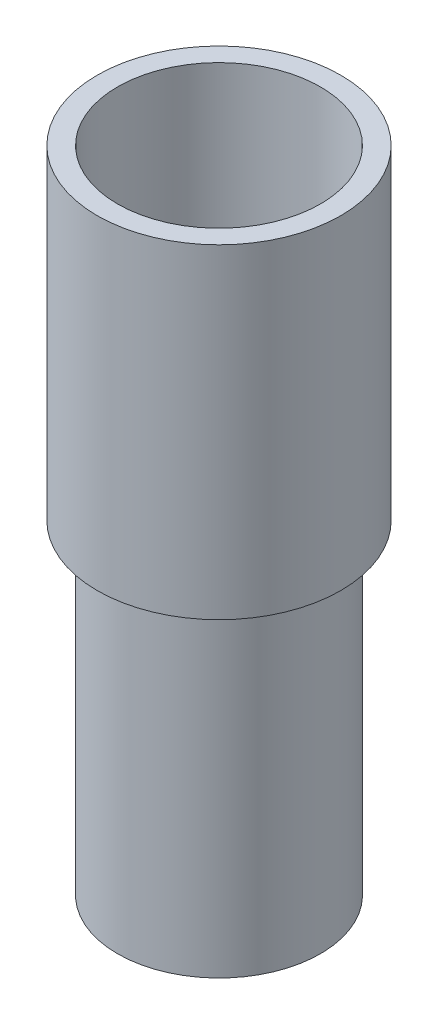
ISO-10303-21;
HEADER;
FILE_DESCRIPTION(('STEP AP214'),'2;1');
FILE_NAME('part.step','',(''),(''),'','','');
FILE_SCHEMA(('AUTOMOTIVE_DESIGN { 1 0 10303 214 1 1 1 1 }'));
ENDSEC;
DATA;
#1=APPLICATION_CONTEXT('core data for automotive mechanical design processes');
#2=APPLICATION_PROTOCOL_DEFINITION('international standard','automotive_design',2000,#1);
#3=PRODUCT_CONTEXT('',#1,'mechanical');
#4=PRODUCT('Part','Part','',(#3));
#5=PRODUCT_RELATED_PRODUCT_CATEGORY('part','',(#4));
#6=PRODUCT_DEFINITION_FORMATION('','',#4);
#7=PRODUCT_DEFINITION_CONTEXT('part definition',#1,'design');
#8=PRODUCT_DEFINITION('design','',#6,#7);
#9=PRODUCT_DEFINITION_SHAPE('','',#8);
#10=(LENGTH_UNIT() NAMED_UNIT(*) SI_UNIT(.MILLI.,.METRE.));
#11=(NAMED_UNIT(*) PLANE_ANGLE_UNIT() SI_UNIT($,.RADIAN.));
#12=(NAMED_UNIT(*) SI_UNIT($,.STERADIAN.) SOLID_ANGLE_UNIT());
#13=UNCERTAINTY_MEASURE_WITH_UNIT(LENGTH_MEASURE(1.E-05),#10,'distance_accuracy_value','');
#14=(GEOMETRIC_REPRESENTATION_CONTEXT(3) GLOBAL_UNCERTAINTY_ASSIGNED_CONTEXT((#13)) GLOBAL_UNIT_ASSIGNED_CONTEXT((#10,
#11,#12)) REPRESENTATION_CONTEXT('',''));
#15=CARTESIAN_POINT('',(0.,0.,0.));
#16=DIRECTION('',(0.,0.,1.));
#17=DIRECTION('',(1.,0.,0.));
#18=AXIS2_PLACEMENT_3D('',#15,#16,#17);
#19=CARTESIAN_POINT('',(0.,0.,0.));
#20=DIRECTION('',(0.,1.,0.));
#21=DIRECTION('',(0.,0.,1.));
#22=AXIS2_PLACEMENT_3D('',#19,#20,#21);
#23=PLANE('',#22);
#24=CARTESIAN_POINT('',(0.,0.,0.));
#25=DIRECTION('',(0.,1.,0.));
#26=DIRECTION('',(0.,0.,1.));
#27=AXIS2_PLACEMENT_3D('',#24,#25,#26);
#28=CIRCLE('',#27,7.9375);
#29=CARTESIAN_POINT('',(0.,0.,7.9375));
#30=VERTEX_POINT('',#29);
#31=EDGE_CURVE('E72',#30,#30,#28,.T.);
#32=ORIENTED_EDGE('',*,*,#31,.T.);
#33=EDGE_LOOP('',(#32));
#34=FACE_BOUND('',#33,.T.);
#35=CARTESIAN_POINT('',(0.,0.,0.));
#36=DIRECTION('',(0.,1.,0.));
#37=DIRECTION('',(0.,0.,1.));
#38=AXIS2_PLACEMENT_3D('',#35,#36,#37);
#39=CIRCLE('',#38,9.525);
#40=CARTESIAN_POINT('',(0.,0.,9.525));
#41=VERTEX_POINT('',#40);
#42=EDGE_CURVE('E63',#41,#41,#39,.T.);
#43=ORIENTED_EDGE('',*,*,#42,.F.);
#44=EDGE_LOOP('',(#43));
#45=FACE_BOUND('',#44,.T.);
#46=ADVANCED_FACE('F59',(#34,#45),#23,.F.);
#47=CARTESIAN_POINT('',(0.,25.4,0.));
#48=DIRECTION('',(0.,-1.,0.));
#49=DIRECTION('',(0.,0.,-1.));
#50=AXIS2_PLACEMENT_3D('',#47,#48,#49);
#51=CYLINDRICAL_SURFACE('',#50,9.525);
#52=CARTESIAN_POINT('',(0.,25.4,0.));
#53=DIRECTION('',(0.,1.,0.));
#54=DIRECTION('',(0.,0.,1.));
#55=AXIS2_PLACEMENT_3D('',#52,#53,#54);
#56=CIRCLE('',#55,9.525);
#57=CARTESIAN_POINT('',(0.,25.4,9.525));
#58=VERTEX_POINT('',#57);
#59=EDGE_CURVE('E11',#58,#58,#56,.T.);
#60=ORIENTED_EDGE('',*,*,#59,.F.);
#61=EDGE_LOOP('',(#60));
#62=FACE_BOUND('',#61,.T.);
#63=ORIENTED_EDGE('',*,*,#42,.T.);
#64=EDGE_LOOP('',(#63));
#65=FACE_BOUND('',#64,.T.);
#66=ADVANCED_FACE('F61',(#62,#65),#51,.T.);
#67=CARTESIAN_POINT('',(0.,25.4,0.));
#68=DIRECTION('',(0.,1.,0.));
#69=DIRECTION('',(0.,0.,1.));
#70=AXIS2_PLACEMENT_3D('',#67,#68,#69);
#71=PLANE('',#70);
#72=CARTESIAN_POINT('',(0.,25.4,0.));
#73=DIRECTION('',(0.,1.,0.));
#74=DIRECTION('',(0.,0.,1.));
#75=AXIS2_PLACEMENT_3D('',#72,#73,#74);
#76=CIRCLE('',#75,7.9375);
#77=CARTESIAN_POINT('',(0.,25.4,7.9375));
#78=VERTEX_POINT('',#77);
#79=EDGE_CURVE('E80',#78,#78,#76,.T.);
#80=ORIENTED_EDGE('',*,*,#79,.F.);
#81=EDGE_LOOP('',(#80));
#82=FACE_BOUND('',#81,.T.);
#83=ORIENTED_EDGE('',*,*,#59,.T.);
#84=EDGE_LOOP('',(#83));
#85=FACE_BOUND('',#84,.T.);
#86=ADVANCED_FACE('F103',(#82,#85),#71,.T.);
#87=CARTESIAN_POINT('',(0.,-25.4,0.));
#88=DIRECTION('',(0.,1.,0.));
#89=DIRECTION('',(0.,0.,1.));
#90=AXIS2_PLACEMENT_3D('',#87,#88,#89);
#91=CYLINDRICAL_SURFACE('',#90,7.9375);
#92=CARTESIAN_POINT('',(0.,-25.4,0.));
#93=DIRECTION('',(0.,1.,0.));
#94=DIRECTION('',(0.,0.,1.));
#95=AXIS2_PLACEMENT_3D('',#92,#93,#94);
#96=CIRCLE('',#95,7.9375);
#97=CARTESIAN_POINT('',(0.,-25.4,7.9375));
#98=VERTEX_POINT('',#97);
#99=EDGE_CURVE('E70',#98,#98,#96,.T.);
#100=ORIENTED_EDGE('',*,*,#99,.T.);
#101=EDGE_LOOP('',(#100));
#102=FACE_BOUND('',#101,.T.);
#103=ORIENTED_EDGE('',*,*,#31,.F.);
#104=EDGE_LOOP('',(#103));
#105=FACE_BOUND('',#104,.T.);
#106=ADVANCED_FACE('F97',(#102,#105),#91,.T.);
#107=CARTESIAN_POINT('',(0.,-25.4,0.));
#108=DIRECTION('',(0.,1.,0.));
#109=DIRECTION('',(0.,0.,1.));
#110=AXIS2_PLACEMENT_3D('',#107,#108,#109);
#111=PLANE('',#110);
#112=CARTESIAN_POINT('',(0.,-25.4,0.));
#113=DIRECTION('',(0.,-1.,0.));
#114=DIRECTION('',(0.,0.,-1.));
#115=AXIS2_PLACEMENT_3D('',#112,#113,#114);
#116=CIRCLE('',#115,6.34999999999999);
#117=CARTESIAN_POINT('',(0.,-25.4,-6.34999999999999));
#118=VERTEX_POINT('',#117);
#119=EDGE_CURVE('E86',#118,#118,#116,.T.);
#120=ORIENTED_EDGE('',*,*,#119,.F.);
#121=EDGE_LOOP('',(#120));
#122=FACE_BOUND('',#121,.T.);
#123=ORIENTED_EDGE('',*,*,#99,.F.);
#124=EDGE_LOOP('',(#123));
#125=FACE_BOUND('',#124,.T.);
#126=ADVANCED_FACE('F93',(#122,#125),#111,.F.);
#127=CARTESIAN_POINT('',(0.,4.76933116353126,0.));
#128=DIRECTION('',(0.,1.,0.));
#129=DIRECTION('',(0.,0.,1.));
#130=AXIS2_PLACEMENT_3D('',#127,#128,#129);
#131=CONICAL_SURFACE('',#130,7.9375,1.02974425867665);
#132=CARTESIAN_POINT('',(0.,3.81546493082501,0.));
#133=DIRECTION('',(0.,1.,0.));
#134=DIRECTION('',(0.,0.,1.));
#135=AXIS2_PLACEMENT_3D('',#132,#133,#134);
#136=CIRCLE('',#135,6.34999999999999);
#137=CARTESIAN_POINT('',(0.,3.81546493082501,6.34999999999999));
#138=VERTEX_POINT('',#137);
#139=EDGE_CURVE('E83',#138,#138,#136,.F.);
#140=ORIENTED_EDGE('',*,*,#139,.T.);
#141=EDGE_LOOP('',(#140));
#142=FACE_BOUND('',#141,.T.);
#143=CARTESIAN_POINT('',(0.,4.76933116353126,0.));
#144=DIRECTION('',(0.,1.,0.));
#145=DIRECTION('',(0.,0.,1.));
#146=AXIS2_PLACEMENT_3D('',#143,#144,#145);
#147=CIRCLE('',#146,7.9375);
#148=CARTESIAN_POINT('',(0.,4.76933116353126,7.9375));
#149=VERTEX_POINT('',#148);
#150=EDGE_CURVE('E75',#149,#149,#147,.T.);
#151=ORIENTED_EDGE('',*,*,#150,.T.);
#152=EDGE_LOOP('',(#151));
#153=FACE_BOUND('',#152,.T.);
#154=ADVANCED_FACE('F96',(#142,#153),#131,.F.);
#155=CARTESIAN_POINT('',(0.,25.4,0.));
#156=DIRECTION('',(0.,1.,0.));
#157=DIRECTION('',(0.,0.,1.));
#158=AXIS2_PLACEMENT_3D('',#155,#156,#157);
#159=CYLINDRICAL_SURFACE('',#158,7.9375);
#160=ORIENTED_EDGE('',*,*,#150,.F.);
#161=EDGE_LOOP('',(#160));
#162=FACE_BOUND('',#161,.T.);
#163=ORIENTED_EDGE('',*,*,#79,.T.);
#164=EDGE_LOOP('',(#163));
#165=FACE_BOUND('',#164,.T.);
#166=ADVANCED_FACE('F125',(#162,#165),#159,.F.);
#167=CARTESIAN_POINT('',(0.,-25.4,0.));
#168=DIRECTION('',(0.,-1.,0.));
#169=DIRECTION('',(0.,0.,-1.));
#170=AXIS2_PLACEMENT_3D('',#167,#168,#169);
#171=CYLINDRICAL_SURFACE('',#170,6.34999999999999);
#172=ORIENTED_EDGE('',*,*,#119,.T.);
#173=EDGE_LOOP('',(#172));
#174=FACE_BOUND('',#173,.T.);
#175=ORIENTED_EDGE('',*,*,#139,.F.);
#176=EDGE_LOOP('',(#175));
#177=FACE_BOUND('',#176,.T.);
#178=ADVANCED_FACE('F90',(#174,#177),#171,.F.);
#179=CLOSED_SHELL('',(#46,#66,#86,#106,#126,#154,#166,#178));
#180=MANIFOLD_SOLID_BREP('B2',#179);
#181=ADVANCED_BREP_SHAPE_REPRESENTATION('',(#18,#180),#14);
#182=SHAPE_DEFINITION_REPRESENTATION(#9,#181);
ENDSEC;
END-ISO-10303-21;
